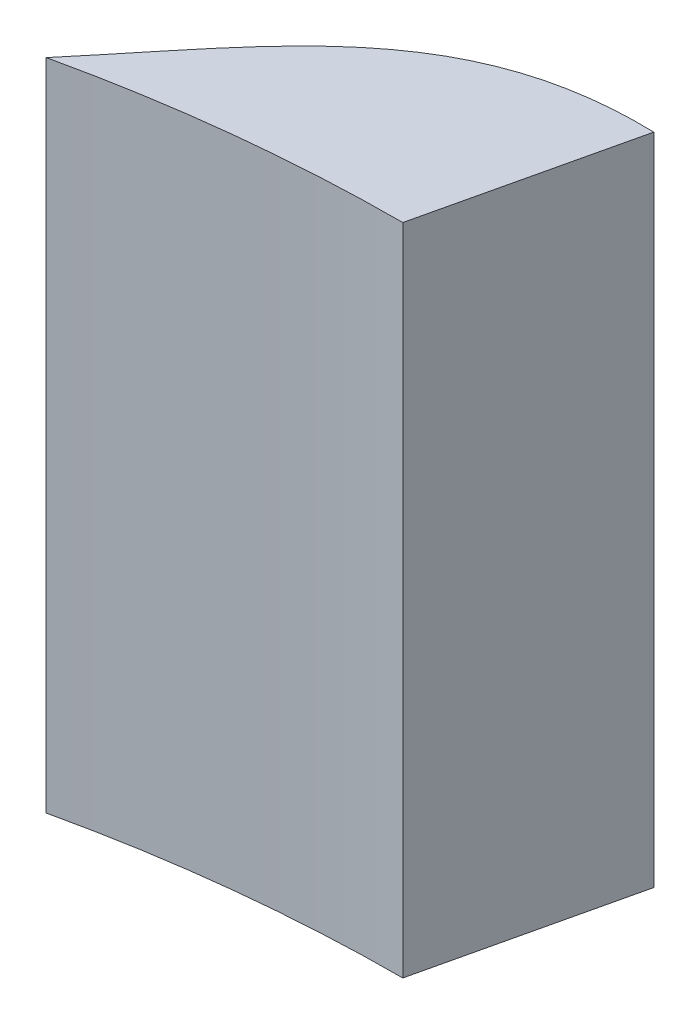
ISO-10303-21;
HEADER;
FILE_DESCRIPTION(('STEP AP214'),'2;1');
FILE_NAME('part.step','',(''),(''),'','','');
FILE_SCHEMA(('AUTOMOTIVE_DESIGN { 1 0 10303 214 1 1 1 1 }'));
ENDSEC;
DATA;
#1=APPLICATION_CONTEXT('core data for automotive mechanical design processes');
#2=APPLICATION_PROTOCOL_DEFINITION('international standard','automotive_design',2000,#1);
#3=PRODUCT_CONTEXT('',#1,'mechanical');
#4=PRODUCT('Part','Part','',(#3));
#5=PRODUCT_RELATED_PRODUCT_CATEGORY('part','',(#4));
#6=PRODUCT_DEFINITION_FORMATION('','',#4);
#7=PRODUCT_DEFINITION_CONTEXT('part definition',#1,'design');
#8=PRODUCT_DEFINITION('design','',#6,#7);
#9=PRODUCT_DEFINITION_SHAPE('','',#8);
#10=(LENGTH_UNIT() NAMED_UNIT(*) SI_UNIT(.MILLI.,.METRE.));
#11=(NAMED_UNIT(*) PLANE_ANGLE_UNIT() SI_UNIT($,.RADIAN.));
#12=(NAMED_UNIT(*) SI_UNIT($,.STERADIAN.) SOLID_ANGLE_UNIT());
#13=UNCERTAINTY_MEASURE_WITH_UNIT(LENGTH_MEASURE(1.E-05),#10,'distance_accuracy_value','');
#14=(GEOMETRIC_REPRESENTATION_CONTEXT(3) GLOBAL_UNCERTAINTY_ASSIGNED_CONTEXT((#13)) GLOBAL_UNIT_ASSIGNED_CONTEXT((#10,
#11,#12)) REPRESENTATION_CONTEXT('',''));
#15=CARTESIAN_POINT('',(0.,0.,0.));
#16=DIRECTION('',(0.,0.,1.));
#17=DIRECTION('',(1.,0.,0.));
#18=AXIS2_PLACEMENT_3D('',#15,#16,#17);
#19=CARTESIAN_POINT('',(2.88338767028967,40.,-102.45943624451));
#20=CARTESIAN_POINT('',(-8.96084278470508,40.,-102.792753597306));
#21=CARTESIAN_POINT('',(-13.2266067657731,40.,-95.391928468004));
#22=CARTESIAN_POINT('',(-19.6329735251046,40.,-87.8324902901116));
#23=B_SPLINE_CURVE_WITH_KNOTS('',3,(#19,#20,#21,#22),.UNSPECIFIED.,.F.,.F.,(4,4),(0.,1.),.UNSPECIFIED.);
#24=DIRECTION('',(0.,-1.,0.));
#25=VECTOR('',#24,1.);
#26=SURFACE_OF_LINEAR_EXTRUSION('',#23,#25);
#27=CARTESIAN_POINT('',(2.88338767028967,0.,-102.45943624451));
#28=CARTESIAN_POINT('',(-8.96084278470508,0.,-102.792753597306));
#29=CARTESIAN_POINT('',(-13.2266067657731,0.,-95.391928468004));
#30=CARTESIAN_POINT('',(-19.6329735251046,0.,-87.8324902901116));
#31=B_SPLINE_CURVE_WITH_KNOTS('',3,(#27,#28,#29,#30),.UNSPECIFIED.,.F.,.F.,(4,4),(0.,1.),.UNSPECIFIED.);
#32=CARTESIAN_POINT('',(2.88338767028967,0.,-102.45943624451));
#33=VERTEX_POINT('',#32);
#34=CARTESIAN_POINT('',(-19.6329735251046,0.,-87.8324902901116));
#35=VERTEX_POINT('',#34);
#36=EDGE_CURVE('E80',#33,#35,#31,.T.);
#37=ORIENTED_EDGE('',*,*,#36,.T.);
#38=DIRECTION('',(0.,-1.,0.));
#39=VECTOR('',#38,1.);
#40=CARTESIAN_POINT('',(-19.6329735251046,40.,-87.8324902901116));
#41=LINE('',#40,#39);
#42=CARTESIAN_POINT('',(-19.6329735251046,40.,-87.8324902901116));
#43=VERTEX_POINT('',#42);
#44=EDGE_CURVE('E11',#43,#35,#41,.T.);
#45=ORIENTED_EDGE('',*,*,#44,.F.);
#46=CARTESIAN_POINT('',(2.88338767028967,40.,-102.45943624451));
#47=VERTEX_POINT('',#46);
#48=EDGE_CURVE('E74',#47,#43,#23,.T.);
#49=ORIENTED_EDGE('',*,*,#48,.F.);
#50=DIRECTION('',(0.,-1.,0.));
#51=VECTOR('',#50,1.);
#52=CARTESIAN_POINT('',(2.88338767028967,40.,-102.45943624451));
#53=LINE('',#52,#51);
#54=EDGE_CURVE('E81',#47,#33,#53,.T.);
#55=ORIENTED_EDGE('',*,*,#54,.T.);
#56=EDGE_LOOP('',(#37,#45,#49,#55));
#57=FACE_BOUND('',#56,.T.);
#58=ADVANCED_FACE('F33',(#57),#26,.F.);
#59=CARTESIAN_POINT('',(0.,40.,0.));
#60=DIRECTION('',(0.,-1.,0.));
#61=DIRECTION('',(0.,0.,-1.));
#62=AXIS2_PLACEMENT_3D('',#59,#60,#61);
#63=CYLINDRICAL_SURFACE('',#62,90.);
#64=CARTESIAN_POINT('',(0.,0.,0.));
#65=DIRECTION('',(0.,-1.,0.));
#66=DIRECTION('',(0.,0.,-1.));
#67=AXIS2_PLACEMENT_3D('',#64,#65,#66);
#68=CIRCLE('',#67,90.);
#69=CARTESIAN_POINT('',(0.,0.,-90.));
#70=VERTEX_POINT('',#69);
#71=EDGE_CURVE('E62',#35,#70,#68,.T.);
#72=ORIENTED_EDGE('',*,*,#71,.T.);
#73=DIRECTION('',(0.,-1.,0.));
#74=VECTOR('',#73,1.);
#75=CARTESIAN_POINT('',(0.,40.,-90.));
#76=LINE('',#75,#74);
#77=CARTESIAN_POINT('',(0.,40.,-90.));
#78=VERTEX_POINT('',#77);
#79=EDGE_CURVE('E42',#78,#70,#76,.T.);
#80=ORIENTED_EDGE('',*,*,#79,.F.);
#81=CARTESIAN_POINT('',(0.,40.,0.));
#82=DIRECTION('',(0.,-1.,0.));
#83=DIRECTION('',(0.,0.,-1.));
#84=AXIS2_PLACEMENT_3D('',#81,#82,#83);
#85=CIRCLE('',#84,90.);
#86=EDGE_CURVE('E70',#43,#78,#85,.T.);
#87=ORIENTED_EDGE('',*,*,#86,.F.);
#88=ORIENTED_EDGE('',*,*,#44,.T.);
#89=EDGE_LOOP('',(#72,#80,#87,#88));
#90=FACE_BOUND('',#89,.T.);
#91=ADVANCED_FACE('F71',(#90),#63,.F.);
#92=CARTESIAN_POINT('',(0.,40.,-90.));
#93=DIRECTION('',(-0.974251668460918,0.,-0.225463270847197));
#94=DIRECTION('',(-0.225463270847197,0.,0.974251668460918));
#95=AXIS2_PLACEMENT_3D('',#92,#93,#94);
#96=PLANE('',#95);
#97=DIRECTION('',(0.225463270847197,0.,-0.974251668460919));
#98=VECTOR('',#97,1.);
#99=CARTESIAN_POINT('',(0.,0.,-90.));
#100=LINE('',#99,#98);
#101=EDGE_CURVE('E67',#70,#33,#100,.T.);
#102=ORIENTED_EDGE('',*,*,#101,.T.);
#103=ORIENTED_EDGE('',*,*,#54,.F.);
#104=DIRECTION('',(0.225463270847197,0.,-0.974251668460919));
#105=VECTOR('',#104,1.);
#106=CARTESIAN_POINT('',(0.,40.,-90.));
#107=LINE('',#106,#105);
#108=EDGE_CURVE('E50',#78,#47,#107,.T.);
#109=ORIENTED_EDGE('',*,*,#108,.F.);
#110=ORIENTED_EDGE('',*,*,#79,.T.);
#111=EDGE_LOOP('',(#102,#103,#109,#110));
#112=FACE_BOUND('',#111,.T.);
#113=ADVANCED_FACE('F93',(#112),#96,.F.);
#114=CARTESIAN_POINT('',(-10.4139918132812,40.,-98.105746591319));
#115=DIRECTION('',(0.,-1.,0.));
#116=DIRECTION('',(0.,0.,-1.));
#117=AXIS2_PLACEMENT_3D('',#114,#115,#116);
#118=PLANE('',#117);
#119=ORIENTED_EDGE('',*,*,#48,.T.);
#120=ORIENTED_EDGE('',*,*,#86,.T.);
#121=ORIENTED_EDGE('',*,*,#108,.T.);
#122=EDGE_LOOP('',(#119,#120,#121));
#123=FACE_BOUND('',#122,.T.);
#124=ADVANCED_FACE('F77',(#123),#118,.F.);
#125=CARTESIAN_POINT('',(-10.4139918132812,0.,-98.105746591319));
#126=DIRECTION('',(0.,-1.,0.));
#127=DIRECTION('',(0.,0.,-1.));
#128=AXIS2_PLACEMENT_3D('',#125,#126,#127);
#129=PLANE('',#128);
#130=ORIENTED_EDGE('',*,*,#36,.F.);
#131=ORIENTED_EDGE('',*,*,#101,.F.);
#132=ORIENTED_EDGE('',*,*,#71,.F.);
#133=EDGE_LOOP('',(#130,#131,#132));
#134=FACE_BOUND('',#133,.T.);
#135=ADVANCED_FACE('F94',(#134),#129,.T.);
#136=CLOSED_SHELL('',(#58,#91,#113,#124,#135));
#137=MANIFOLD_SOLID_BREP('B2',#136);
#138=ADVANCED_BREP_SHAPE_REPRESENTATION('',(#18,#137),#14);
#139=SHAPE_DEFINITION_REPRESENTATION(#9,#138);
ENDSEC;
END-ISO-10303-21;
